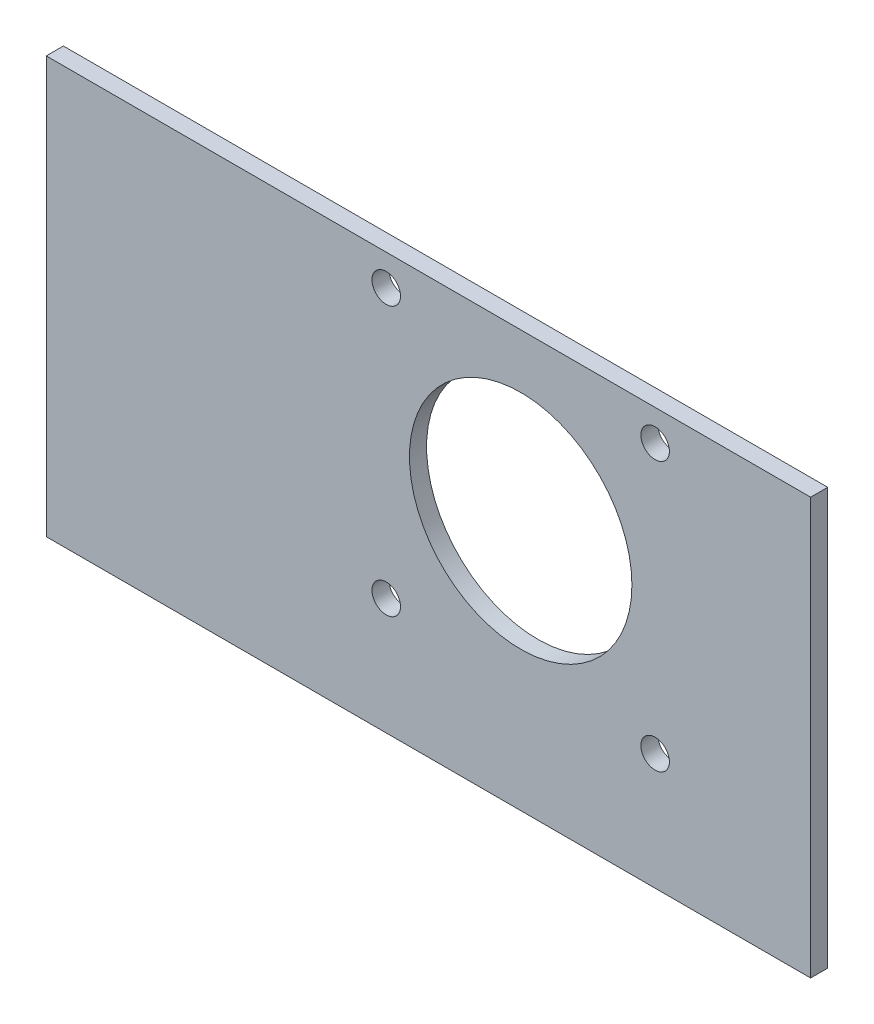
ISO-10303-21;
HEADER;
FILE_DESCRIPTION(('STEP AP214'),'2;1');
FILE_NAME('part.step','',(''),(''),'','','');
FILE_SCHEMA(('AUTOMOTIVE_DESIGN { 1 0 10303 214 1 1 1 1 }'));
ENDSEC;
DATA;
#1=APPLICATION_CONTEXT('core data for automotive mechanical design processes');
#2=APPLICATION_PROTOCOL_DEFINITION('international standard','automotive_design',2000,#1);
#3=PRODUCT_CONTEXT('',#1,'mechanical');
#4=PRODUCT('Part','Part','',(#3));
#5=PRODUCT_RELATED_PRODUCT_CATEGORY('part','',(#4));
#6=PRODUCT_DEFINITION_FORMATION('','',#4);
#7=PRODUCT_DEFINITION_CONTEXT('part definition',#1,'design');
#8=PRODUCT_DEFINITION('design','',#6,#7);
#9=PRODUCT_DEFINITION_SHAPE('','',#8);
#10=(LENGTH_UNIT() NAMED_UNIT(*) SI_UNIT(.MILLI.,.METRE.));
#11=(NAMED_UNIT(*) PLANE_ANGLE_UNIT() SI_UNIT($,.RADIAN.));
#12=(NAMED_UNIT(*) SI_UNIT($,.STERADIAN.) SOLID_ANGLE_UNIT());
#13=UNCERTAINTY_MEASURE_WITH_UNIT(LENGTH_MEASURE(1.E-05),#10,'distance_accuracy_value','');
#14=(GEOMETRIC_REPRESENTATION_CONTEXT(3) GLOBAL_UNCERTAINTY_ASSIGNED_CONTEXT((#13)) GLOBAL_UNIT_ASSIGNED_CONTEXT((#10,
#11,#12)) REPRESENTATION_CONTEXT('',''));
#15=CARTESIAN_POINT('',(0.,0.,0.));
#16=DIRECTION('',(0.,0.,1.));
#17=DIRECTION('',(1.,0.,0.));
#18=AXIS2_PLACEMENT_3D('',#15,#16,#17);
#19=CARTESIAN_POINT('',(0.,0.,3.));
#20=DIRECTION('',(0.,0.,-1.));
#21=DIRECTION('',(-1.,0.,0.));
#22=AXIS2_PLACEMENT_3D('',#19,#20,#21);
#23=PLANE('',#22);
#24=DIRECTION('',(0.,-1.,0.));
#25=VECTOR('',#24,1.);
#26=CARTESIAN_POINT('',(0.,0.,3.));
#27=LINE('',#26,#25);
#28=CARTESIAN_POINT('',(0.,73.,3.));
#29=VERTEX_POINT('',#28);
#30=CARTESIAN_POINT('',(0.,0.,3.));
#31=VERTEX_POINT('',#30);
#32=EDGE_CURVE('E90',#29,#31,#27,.T.);
#33=ORIENTED_EDGE('',*,*,#32,.T.);
#34=DIRECTION('',(1.,0.,0.));
#35=VECTOR('',#34,1.);
#36=CARTESIAN_POINT('',(0.,0.,3.));
#37=LINE('',#36,#35);
#38=CARTESIAN_POINT('',(134.,0.,3.));
#39=VERTEX_POINT('',#38);
#40=EDGE_CURVE('E85',#31,#39,#37,.T.);
#41=ORIENTED_EDGE('',*,*,#40,.T.);
#42=DIRECTION('',(0.,1.,0.));
#43=VECTOR('',#42,1.);
#44=CARTESIAN_POINT('',(134.,0.,3.));
#45=LINE('',#44,#43);
#46=CARTESIAN_POINT('',(134.,73.,3.));
#47=VERTEX_POINT('',#46);
#48=EDGE_CURVE('E88',#39,#47,#45,.T.);
#49=ORIENTED_EDGE('',*,*,#48,.T.);
#50=DIRECTION('',(-1.,0.,0.));
#51=VECTOR('',#50,1.);
#52=CARTESIAN_POINT('',(0.,73.,3.));
#53=LINE('',#52,#51);
#54=EDGE_CURVE('E55',#47,#29,#53,.T.);
#55=ORIENTED_EDGE('',*,*,#54,.T.);
#56=EDGE_LOOP('',(#33,#41,#49,#55));
#57=FACE_BOUND('',#56,.T.);
#58=CARTESIAN_POINT('',(59.5997513829417,20.4300000060256,3.));
#59=DIRECTION('',(0.,0.,1.));
#60=DIRECTION('',(1.,0.,0.));
#61=AXIS2_PLACEMENT_3D('',#58,#59,#60);
#62=CIRCLE('',#61,2.49999999415662);
#63=CARTESIAN_POINT('',(62.0997513770983,20.4300000060256,3.));
#64=VERTEX_POINT('',#63);
#65=EDGE_CURVE('E105',#64,#64,#62,.T.);
#66=ORIENTED_EDGE('',*,*,#65,.F.);
#67=EDGE_LOOP('',(#66));
#68=FACE_BOUND('',#67,.T.);
#69=CARTESIAN_POINT('',(106.739751382942,20.4300000060258,3.));
#70=DIRECTION('',(0.,0.,1.));
#71=DIRECTION('',(1.,0.,0.));
#72=AXIS2_PLACEMENT_3D('',#69,#70,#71);
#73=CIRCLE('',#72,2.49999999415658);
#74=CARTESIAN_POINT('',(109.239751377098,20.4300000060258,3.));
#75=VERTEX_POINT('',#74);
#76=EDGE_CURVE('E120',#75,#75,#73,.T.);
#77=ORIENTED_EDGE('',*,*,#76,.F.);
#78=EDGE_LOOP('',(#77));
#79=FACE_BOUND('',#78,.T.);
#80=CARTESIAN_POINT('',(59.5997513829417,67.5700000060256,3.));
#81=DIRECTION('',(0.,0.,1.));
#82=DIRECTION('',(1.,0.,0.));
#83=AXIS2_PLACEMENT_3D('',#80,#81,#82);
#84=CIRCLE('',#83,2.49999999415664);
#85=CARTESIAN_POINT('',(62.0997513770983,67.5700000060256,3.));
#86=VERTEX_POINT('',#85);
#87=EDGE_CURVE('E126',#86,#86,#84,.T.);
#88=ORIENTED_EDGE('',*,*,#87,.F.);
#89=EDGE_LOOP('',(#88));
#90=FACE_BOUND('',#89,.T.);
#91=CARTESIAN_POINT('',(106.739751382942,67.5700000060256,3.));
#92=DIRECTION('',(0.,0.,1.));
#93=DIRECTION('',(1.,0.,0.));
#94=AXIS2_PLACEMENT_3D('',#91,#92,#93);
#95=CIRCLE('',#94,2.49999999415663);
#96=CARTESIAN_POINT('',(109.239751377098,67.5700000060256,3.));
#97=VERTEX_POINT('',#96);
#98=EDGE_CURVE('E132',#97,#97,#95,.T.);
#99=ORIENTED_EDGE('',*,*,#98,.F.);
#100=EDGE_LOOP('',(#99));
#101=FACE_BOUND('',#100,.T.);
#102=CARTESIAN_POINT('',(83.1697513829416,44.0000000060257,3.));
#103=DIRECTION('',(0.,0.,1.));
#104=DIRECTION('',(1.,0.,0.));
#105=AXIS2_PLACEMENT_3D('',#102,#103,#104);
#106=CIRCLE('',#105,19.5);
#107=CARTESIAN_POINT('',(102.669751382942,44.0000000060257,3.));
#108=VERTEX_POINT('',#107);
#109=EDGE_CURVE('E138',#108,#108,#106,.T.);
#110=ORIENTED_EDGE('',*,*,#109,.F.);
#111=EDGE_LOOP('',(#110));
#112=FACE_BOUND('',#111,.T.);
#113=ADVANCED_FACE('F38',(#57,#68,#79,#90,#101,#112),#23,.F.);
#114=CARTESIAN_POINT('',(0.,0.,0.));
#115=DIRECTION('',(0.,0.,-1.));
#116=DIRECTION('',(-1.,0.,0.));
#117=AXIS2_PLACEMENT_3D('',#114,#115,#116);
#118=PLANE('',#117);
#119=CARTESIAN_POINT('',(106.739751382942,67.5700000060256,0.));
#120=DIRECTION('',(0.,0.,1.));
#121=DIRECTION('',(1.,0.,0.));
#122=AXIS2_PLACEMENT_3D('',#119,#120,#121);
#123=CIRCLE('',#122,2.49999999415663);
#124=CARTESIAN_POINT('',(109.239751377098,67.5700000060256,0.));
#125=VERTEX_POINT('',#124);
#126=EDGE_CURVE('E135',#125,#125,#123,.T.);
#127=ORIENTED_EDGE('',*,*,#126,.T.);
#128=EDGE_LOOP('',(#127));
#129=FACE_BOUND('',#128,.T.);
#130=CARTESIAN_POINT('',(106.739751382942,20.4300000060258,0.));
#131=DIRECTION('',(0.,0.,1.));
#132=DIRECTION('',(1.,0.,0.));
#133=AXIS2_PLACEMENT_3D('',#130,#131,#132);
#134=CIRCLE('',#133,2.49999999415658);
#135=CARTESIAN_POINT('',(109.239751377098,20.4300000060258,0.));
#136=VERTEX_POINT('',#135);
#137=EDGE_CURVE('E123',#136,#136,#134,.T.);
#138=ORIENTED_EDGE('',*,*,#137,.T.);
#139=EDGE_LOOP('',(#138));
#140=FACE_BOUND('',#139,.T.);
#141=DIRECTION('',(0.,-1.,0.));
#142=VECTOR('',#141,1.);
#143=CARTESIAN_POINT('',(0.,0.,0.));
#144=LINE('',#143,#142);
#145=CARTESIAN_POINT('',(0.,73.,0.));
#146=VERTEX_POINT('',#145);
#147=CARTESIAN_POINT('',(0.,0.,0.));
#148=VERTEX_POINT('',#147);
#149=EDGE_CURVE('E102',#146,#148,#144,.T.);
#150=ORIENTED_EDGE('',*,*,#149,.F.);
#151=DIRECTION('',(-1.,0.,0.));
#152=VECTOR('',#151,1.);
#153=CARTESIAN_POINT('',(0.,73.,0.));
#154=LINE('',#153,#152);
#155=CARTESIAN_POINT('',(134.,73.,0.));
#156=VERTEX_POINT('',#155);
#157=EDGE_CURVE('E78',#156,#146,#154,.T.);
#158=ORIENTED_EDGE('',*,*,#157,.F.);
#159=DIRECTION('',(0.,1.,0.));
#160=VECTOR('',#159,1.);
#161=CARTESIAN_POINT('',(134.,0.,0.));
#162=LINE('',#161,#160);
#163=CARTESIAN_POINT('',(134.,0.,0.));
#164=VERTEX_POINT('',#163);
#165=EDGE_CURVE('E72',#164,#156,#162,.T.);
#166=ORIENTED_EDGE('',*,*,#165,.F.);
#167=DIRECTION('',(1.,0.,0.));
#168=VECTOR('',#167,1.);
#169=CARTESIAN_POINT('',(0.,0.,0.));
#170=LINE('',#169,#168);
#171=EDGE_CURVE('E94',#148,#164,#170,.T.);
#172=ORIENTED_EDGE('',*,*,#171,.F.);
#173=EDGE_LOOP('',(#150,#158,#166,#172));
#174=FACE_BOUND('',#173,.T.);
#175=CARTESIAN_POINT('',(59.5997513829417,20.4300000060256,0.));
#176=DIRECTION('',(0.,0.,1.));
#177=DIRECTION('',(1.,0.,0.));
#178=AXIS2_PLACEMENT_3D('',#175,#176,#177);
#179=CIRCLE('',#178,2.49999999415662);
#180=CARTESIAN_POINT('',(62.0997513770983,20.4300000060256,0.));
#181=VERTEX_POINT('',#180);
#182=EDGE_CURVE('E117',#181,#181,#179,.T.);
#183=ORIENTED_EDGE('',*,*,#182,.T.);
#184=EDGE_LOOP('',(#183));
#185=FACE_BOUND('',#184,.T.);
#186=CARTESIAN_POINT('',(59.5997513829417,67.5700000060256,0.));
#187=DIRECTION('',(0.,0.,1.));
#188=DIRECTION('',(1.,0.,0.));
#189=AXIS2_PLACEMENT_3D('',#186,#187,#188);
#190=CIRCLE('',#189,2.49999999415664);
#191=CARTESIAN_POINT('',(62.0997513770983,67.5700000060256,0.));
#192=VERTEX_POINT('',#191);
#193=EDGE_CURVE('E129',#192,#192,#190,.T.);
#194=ORIENTED_EDGE('',*,*,#193,.T.);
#195=EDGE_LOOP('',(#194));
#196=FACE_BOUND('',#195,.T.);
#197=CARTESIAN_POINT('',(83.1697513829416,44.0000000060257,0.));
#198=DIRECTION('',(0.,0.,1.));
#199=DIRECTION('',(1.,0.,0.));
#200=AXIS2_PLACEMENT_3D('',#197,#198,#199);
#201=CIRCLE('',#200,19.5);
#202=CARTESIAN_POINT('',(102.669751382942,44.0000000060257,0.));
#203=VERTEX_POINT('',#202);
#204=EDGE_CURVE('E141',#203,#203,#201,.T.);
#205=ORIENTED_EDGE('',*,*,#204,.T.);
#206=EDGE_LOOP('',(#205));
#207=FACE_BOUND('',#206,.T.);
#208=ADVANCED_FACE('F113',(#129,#140,#174,#185,#196,#207),#118,.T.);
#209=CARTESIAN_POINT('',(0.,0.,3.));
#210=DIRECTION('',(1.,0.,0.));
#211=DIRECTION('',(0.,0.,-1.));
#212=AXIS2_PLACEMENT_3D('',#209,#210,#211);
#213=PLANE('',#212);
#214=ORIENTED_EDGE('',*,*,#149,.T.);
#215=DIRECTION('',(0.,0.,-1.));
#216=VECTOR('',#215,1.);
#217=CARTESIAN_POINT('',(0.,0.,3.));
#218=LINE('',#217,#216);
#219=EDGE_CURVE('E11',#31,#148,#218,.T.);
#220=ORIENTED_EDGE('',*,*,#219,.F.);
#221=ORIENTED_EDGE('',*,*,#32,.F.);
#222=DIRECTION('',(0.,0.,-1.));
#223=VECTOR('',#222,1.);
#224=CARTESIAN_POINT('',(0.,73.,3.));
#225=LINE('',#224,#223);
#226=EDGE_CURVE('E98',#29,#146,#225,.T.);
#227=ORIENTED_EDGE('',*,*,#226,.T.);
#228=EDGE_LOOP('',(#214,#220,#221,#227));
#229=FACE_BOUND('',#228,.T.);
#230=ADVANCED_FACE('F40',(#229),#213,.F.);
#231=CARTESIAN_POINT('',(0.,0.,3.));
#232=DIRECTION('',(0.,1.,0.));
#233=DIRECTION('',(0.,0.,1.));
#234=AXIS2_PLACEMENT_3D('',#231,#232,#233);
#235=PLANE('',#234);
#236=ORIENTED_EDGE('',*,*,#171,.T.);
#237=DIRECTION('',(0.,0.,-1.));
#238=VECTOR('',#237,1.);
#239=CARTESIAN_POINT('',(134.,0.,3.));
#240=LINE('',#239,#238);
#241=EDGE_CURVE('E47',#39,#164,#240,.T.);
#242=ORIENTED_EDGE('',*,*,#241,.F.);
#243=ORIENTED_EDGE('',*,*,#40,.F.);
#244=ORIENTED_EDGE('',*,*,#219,.T.);
#245=EDGE_LOOP('',(#236,#242,#243,#244));
#246=FACE_BOUND('',#245,.T.);
#247=ADVANCED_FACE('F93',(#246),#235,.F.);
#248=CARTESIAN_POINT('',(134.,0.,3.));
#249=DIRECTION('',(-1.,0.,0.));
#250=DIRECTION('',(0.,0.,1.));
#251=AXIS2_PLACEMENT_3D('',#248,#249,#250);
#252=PLANE('',#251);
#253=ORIENTED_EDGE('',*,*,#165,.T.);
#254=DIRECTION('',(0.,0.,-1.));
#255=VECTOR('',#254,1.);
#256=CARTESIAN_POINT('',(134.,73.,3.));
#257=LINE('',#256,#255);
#258=EDGE_CURVE('E95',#47,#156,#257,.T.);
#259=ORIENTED_EDGE('',*,*,#258,.F.);
#260=ORIENTED_EDGE('',*,*,#48,.F.);
#261=ORIENTED_EDGE('',*,*,#241,.T.);
#262=EDGE_LOOP('',(#253,#259,#260,#261));
#263=FACE_BOUND('',#262,.T.);
#264=ADVANCED_FACE('F96',(#263),#252,.F.);
#265=CARTESIAN_POINT('',(0.,73.,3.));
#266=DIRECTION('',(0.,-1.,0.));
#267=DIRECTION('',(0.,0.,-1.));
#268=AXIS2_PLACEMENT_3D('',#265,#266,#267);
#269=PLANE('',#268);
#270=ORIENTED_EDGE('',*,*,#157,.T.);
#271=ORIENTED_EDGE('',*,*,#226,.F.);
#272=ORIENTED_EDGE('',*,*,#54,.F.);
#273=ORIENTED_EDGE('',*,*,#258,.T.);
#274=EDGE_LOOP('',(#270,#271,#272,#273));
#275=FACE_BOUND('',#274,.T.);
#276=ADVANCED_FACE('F110',(#275),#269,.F.);
#277=CARTESIAN_POINT('',(59.5997513829417,20.4300000060256,3.));
#278=DIRECTION('',(0.,0.,-1.));
#279=DIRECTION('',(-1.,0.,0.));
#280=AXIS2_PLACEMENT_3D('',#277,#278,#279);
#281=CYLINDRICAL_SURFACE('',#280,2.49999999415662);
#282=ORIENTED_EDGE('',*,*,#65,.T.);
#283=EDGE_LOOP('',(#282));
#284=FACE_BOUND('',#283,.T.);
#285=ORIENTED_EDGE('',*,*,#182,.F.);
#286=EDGE_LOOP('',(#285));
#287=FACE_BOUND('',#286,.T.);
#288=ADVANCED_FACE('F158',(#284,#287),#281,.F.);
#289=CARTESIAN_POINT('',(106.739751382942,20.4300000060258,3.));
#290=DIRECTION('',(0.,0.,-1.));
#291=DIRECTION('',(-1.,0.,0.));
#292=AXIS2_PLACEMENT_3D('',#289,#290,#291);
#293=CYLINDRICAL_SURFACE('',#292,2.49999999415658);
#294=ORIENTED_EDGE('',*,*,#76,.T.);
#295=EDGE_LOOP('',(#294));
#296=FACE_BOUND('',#295,.T.);
#297=ORIENTED_EDGE('',*,*,#137,.F.);
#298=EDGE_LOOP('',(#297));
#299=FACE_BOUND('',#298,.T.);
#300=ADVANCED_FACE('F212',(#296,#299),#293,.F.);
#301=CARTESIAN_POINT('',(59.5997513829417,67.5700000060256,3.));
#302=DIRECTION('',(0.,0.,-1.));
#303=DIRECTION('',(-1.,0.,0.));
#304=AXIS2_PLACEMENT_3D('',#301,#302,#303);
#305=CYLINDRICAL_SURFACE('',#304,2.49999999415664);
#306=ORIENTED_EDGE('',*,*,#87,.T.);
#307=EDGE_LOOP('',(#306));
#308=FACE_BOUND('',#307,.T.);
#309=ORIENTED_EDGE('',*,*,#193,.F.);
#310=EDGE_LOOP('',(#309));
#311=FACE_BOUND('',#310,.T.);
#312=ADVANCED_FACE('F221',(#308,#311),#305,.F.);
#313=CARTESIAN_POINT('',(106.739751382942,67.5700000060256,3.));
#314=DIRECTION('',(0.,0.,-1.));
#315=DIRECTION('',(-1.,0.,0.));
#316=AXIS2_PLACEMENT_3D('',#313,#314,#315);
#317=CYLINDRICAL_SURFACE('',#316,2.49999999415663);
#318=ORIENTED_EDGE('',*,*,#98,.T.);
#319=EDGE_LOOP('',(#318));
#320=FACE_BOUND('',#319,.T.);
#321=ORIENTED_EDGE('',*,*,#126,.F.);
#322=EDGE_LOOP('',(#321));
#323=FACE_BOUND('',#322,.T.);
#324=ADVANCED_FACE('F230',(#320,#323),#317,.F.);
#325=CARTESIAN_POINT('',(83.1697513829416,44.0000000060257,3.));
#326=DIRECTION('',(0.,0.,-1.));
#327=DIRECTION('',(-1.,0.,0.));
#328=AXIS2_PLACEMENT_3D('',#325,#326,#327);
#329=CYLINDRICAL_SURFACE('',#328,19.5);
#330=ORIENTED_EDGE('',*,*,#109,.T.);
#331=EDGE_LOOP('',(#330));
#332=FACE_BOUND('',#331,.T.);
#333=ORIENTED_EDGE('',*,*,#204,.F.);
#334=EDGE_LOOP('',(#333));
#335=FACE_BOUND('',#334,.T.);
#336=ADVANCED_FACE('F147',(#332,#335),#329,.F.);
#337=CLOSED_SHELL('',(#113,#208,#230,#247,#264,#276,#288,#300,#312,#324,#336));
#338=MANIFOLD_SOLID_BREP('B2',#337);
#339=ADVANCED_BREP_SHAPE_REPRESENTATION('',(#18,#338),#14);
#340=SHAPE_DEFINITION_REPRESENTATION(#9,#339);
ENDSEC;
END-ISO-10303-21;
